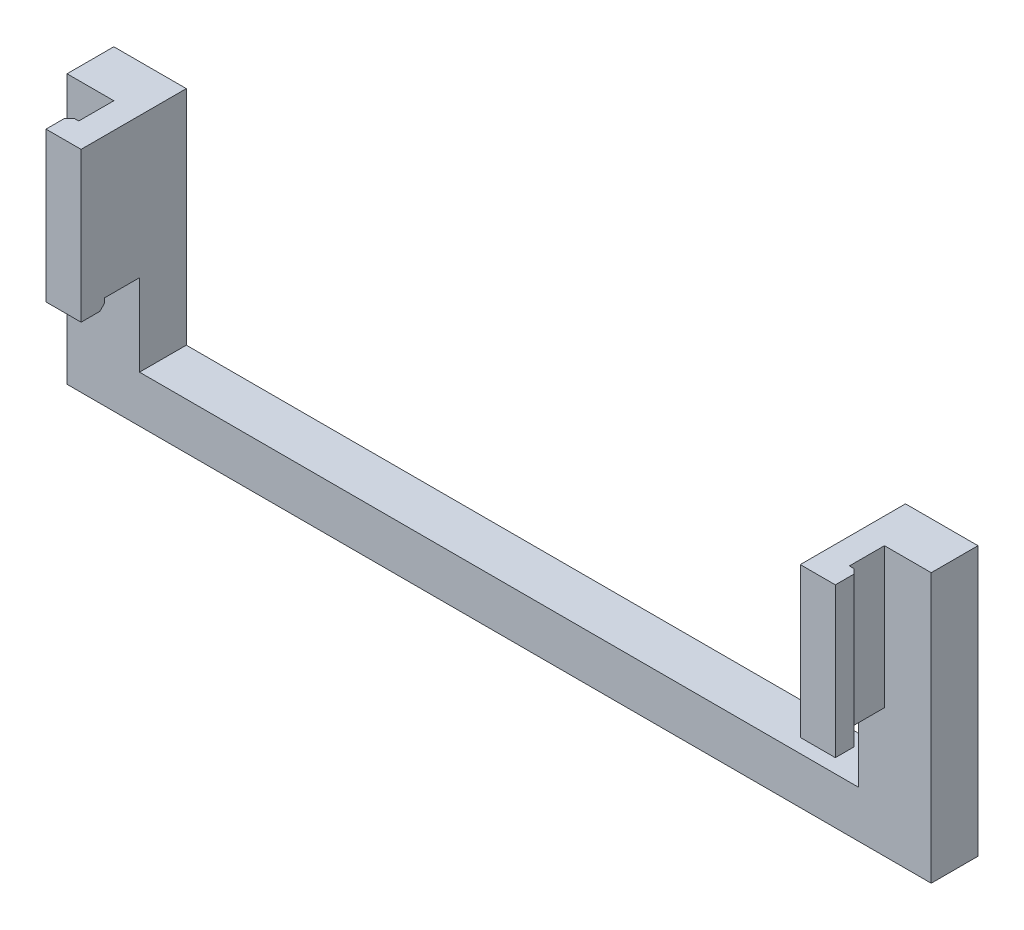
ISO-10303-21;
HEADER;
FILE_DESCRIPTION(('STEP AP214'),'2;1');
FILE_NAME('part.step','',(''),(''),'','','');
FILE_SCHEMA(('AUTOMOTIVE_DESIGN { 1 0 10303 214 1 1 1 1 }'));
ENDSEC;
DATA;
#1=APPLICATION_CONTEXT('core data for automotive mechanical design processes');
#2=APPLICATION_PROTOCOL_DEFINITION('international standard','automotive_design',2000,#1);
#3=PRODUCT_CONTEXT('',#1,'mechanical');
#4=PRODUCT('Part','Part','',(#3));
#5=PRODUCT_RELATED_PRODUCT_CATEGORY('part','',(#4));
#6=PRODUCT_DEFINITION_FORMATION('','',#4);
#7=PRODUCT_DEFINITION_CONTEXT('part definition',#1,'design');
#8=PRODUCT_DEFINITION('design','',#6,#7);
#9=PRODUCT_DEFINITION_SHAPE('','',#8);
#10=(LENGTH_UNIT() NAMED_UNIT(*) SI_UNIT(.MILLI.,.METRE.));
#11=(NAMED_UNIT(*) PLANE_ANGLE_UNIT() SI_UNIT($,.RADIAN.));
#12=(NAMED_UNIT(*) SI_UNIT($,.STERADIAN.) SOLID_ANGLE_UNIT());
#13=UNCERTAINTY_MEASURE_WITH_UNIT(LENGTH_MEASURE(1.E-05),#10,'distance_accuracy_value','');
#14=(GEOMETRIC_REPRESENTATION_CONTEXT(3) GLOBAL_UNCERTAINTY_ASSIGNED_CONTEXT((#13)) GLOBAL_UNIT_ASSIGNED_CONTEXT((#10,
#11,#12)) REPRESENTATION_CONTEXT('',''));
#15=CARTESIAN_POINT('',(0.,0.,0.));
#16=DIRECTION('',(0.,0.,1.));
#17=DIRECTION('',(1.,0.,0.));
#18=AXIS2_PLACEMENT_3D('',#15,#16,#17);
#19=CARTESIAN_POINT('',(0.,0.,0.));
#20=DIRECTION('',(0.,0.,-1.));
#21=DIRECTION('',(-1.,0.,0.));
#22=AXIS2_PLACEMENT_3D('',#19,#20,#21);
#23=PLANE('',#22);
#24=DIRECTION('',(1.,0.,0.));
#25=VECTOR('',#24,1.);
#26=CARTESIAN_POINT('',(296.806912390065,75.4547324301416,0.));
#27=LINE('',#26,#25);
#28=CARTESIAN_POINT('',(296.806912390065,75.4547324301416,0.));
#29=VERTEX_POINT('',#28);
#30=CARTESIAN_POINT('',(297.906988381274,75.4547324301416,0.));
#31=VERTEX_POINT('',#30);
#32=EDGE_CURVE('E260',#29,#31,#27,.T.);
#33=ORIENTED_EDGE('',*,*,#32,.F.);
#34=DIRECTION('',(0.,1.,0.));
#35=VECTOR('',#34,1.);
#36=CARTESIAN_POINT('',(296.806912390065,81.4554276026631,0.));
#37=LINE('',#36,#35);
#38=CARTESIAN_POINT('',(296.806912390065,71.9547324301416,0.));
#39=VERTEX_POINT('',#38);
#40=EDGE_CURVE('E306',#39,#29,#37,.T.);
#41=ORIENTED_EDGE('',*,*,#40,.F.);
#42=DIRECTION('',(1.,0.,0.));
#43=VECTOR('',#42,1.);
#44=CARTESIAN_POINT('',(296.806912390065,71.9547324301416,0.));
#45=LINE('',#44,#43);
#46=CARTESIAN_POINT('',(266.055906266466,71.9547324301416,0.));
#47=VERTEX_POINT('',#46);
#48=EDGE_CURVE('E310',#47,#39,#45,.T.);
#49=ORIENTED_EDGE('',*,*,#48,.F.);
#50=DIRECTION('',(0.,-1.,0.));
#51=VECTOR('',#50,1.);
#52=CARTESIAN_POINT('',(266.055906266466,81.4554276026631,0.));
#53=LINE('',#52,#51);
#54=CARTESIAN_POINT('',(266.055906266466,75.4547324301416,0.));
#55=VERTEX_POINT('',#54);
#56=EDGE_CURVE('E314',#55,#47,#53,.T.);
#57=ORIENTED_EDGE('',*,*,#56,.F.);
#58=DIRECTION('',(1.,0.,0.));
#59=VECTOR('',#58,1.);
#60=CARTESIAN_POINT('',(266.055906266466,75.4547324301416,0.));
#61=LINE('',#60,#59);
#62=CARTESIAN_POINT('',(264.955830275258,75.4547324301416,0.));
#63=VERTEX_POINT('',#62);
#64=EDGE_CURVE('E274',#63,#55,#61,.T.);
#65=ORIENTED_EDGE('',*,*,#64,.F.);
#66=DIRECTION('',(0.,-1.,0.));
#67=VECTOR('',#66,1.);
#68=CARTESIAN_POINT('',(264.955830275258,81.4554276026631,0.));
#69=LINE('',#68,#67);
#70=CARTESIAN_POINT('',(264.955830275258,81.4554276026631,0.));
#71=VERTEX_POINT('',#70);
#72=EDGE_CURVE('E279',#71,#63,#69,.T.);
#73=ORIENTED_EDGE('',*,*,#72,.F.);
#74=DIRECTION('',(1.,0.,0.));
#75=VECTOR('',#74,1.);
#76=CARTESIAN_POINT('',(262.955830275258,81.4554276026631,0.));
#77=LINE('',#76,#75);
#78=CARTESIAN_POINT('',(262.955830275258,81.4554276026631,0.));
#79=VERTEX_POINT('',#78);
#80=EDGE_CURVE('E317',#79,#71,#77,.T.);
#81=ORIENTED_EDGE('',*,*,#80,.F.);
#82=DIRECTION('',(0.,1.,0.));
#83=VECTOR('',#82,1.);
#84=CARTESIAN_POINT('',(262.955830275258,69.9547324301416,0.));
#85=LINE('',#84,#83);
#86=CARTESIAN_POINT('',(262.955830275258,69.9547324301416,0.));
#87=VERTEX_POINT('',#86);
#88=EDGE_CURVE('E321',#87,#79,#85,.T.);
#89=ORIENTED_EDGE('',*,*,#88,.F.);
#90=DIRECTION('',(-1.,0.,0.));
#91=VECTOR('',#90,1.);
#92=CARTESIAN_POINT('',(299.906988381274,69.9547324301416,0.));
#93=LINE('',#92,#91);
#94=CARTESIAN_POINT('',(299.906988381274,69.9547324301416,0.));
#95=VERTEX_POINT('',#94);
#96=EDGE_CURVE('E295',#95,#87,#93,.T.);
#97=ORIENTED_EDGE('',*,*,#96,.F.);
#98=DIRECTION('',(0.,-1.,0.));
#99=VECTOR('',#98,1.);
#100=CARTESIAN_POINT('',(299.906988381274,69.9547324301416,0.));
#101=LINE('',#100,#99);
#102=CARTESIAN_POINT('',(299.906988381274,81.4554276026631,0.));
#103=VERTEX_POINT('',#102);
#104=EDGE_CURVE('E300',#103,#95,#101,.T.);
#105=ORIENTED_EDGE('',*,*,#104,.F.);
#106=DIRECTION('',(1.,0.,0.));
#107=VECTOR('',#106,1.);
#108=CARTESIAN_POINT('',(296.806912390065,81.4554276026631,0.));
#109=LINE('',#108,#107);
#110=CARTESIAN_POINT('',(297.906988381274,81.4554276026631,0.));
#111=VERTEX_POINT('',#110);
#112=EDGE_CURVE('E304',#111,#103,#109,.T.);
#113=ORIENTED_EDGE('',*,*,#112,.F.);
#114=DIRECTION('',(0.,1.,0.));
#115=VECTOR('',#114,1.);
#116=CARTESIAN_POINT('',(297.906988381274,81.4554276026631,0.));
#117=LINE('',#116,#115);
#118=EDGE_CURVE('E256',#31,#111,#117,.T.);
#119=ORIENTED_EDGE('',*,*,#118,.F.);
#120=EDGE_LOOP('',(#33,#41,#49,#57,#65,#73,#81,#89,#97,#105,#113,#119));
#121=FACE_BOUND('',#120,.T.);
#122=ADVANCED_FACE('F35',(#121),#23,.F.);
#123=CARTESIAN_POINT('',(262.955830275258,69.9547324301416,-40.699535847695));
#124=DIRECTION('',(1.,0.,0.));
#125=DIRECTION('',(0.,0.,-1.));
#126=AXIS2_PLACEMENT_3D('',#123,#124,#125);
#127=PLANE('',#126);
#128=DIRECTION('',(0.,1.,0.));
#129=VECTOR('',#128,1.);
#130=CARTESIAN_POINT('',(262.955830275258,69.9547324301416,-2.));
#131=LINE('',#130,#129);
#132=CARTESIAN_POINT('',(262.955830275258,69.9547324301416,-2.));
#133=VERTEX_POINT('',#132);
#134=CARTESIAN_POINT('',(262.955830275258,81.4554276026631,-2.));
#135=VERTEX_POINT('',#134);
#136=EDGE_CURVE('E342',#133,#135,#131,.T.);
#137=ORIENTED_EDGE('',*,*,#136,.F.);
#138=DIRECTION('',(0.,0.,1.));
#139=VECTOR('',#138,1.);
#140=CARTESIAN_POINT('',(262.955830275258,69.9547324301416,-40.699535847695));
#141=LINE('',#140,#139);
#142=EDGE_CURVE('E286',#133,#87,#141,.T.);
#143=ORIENTED_EDGE('',*,*,#142,.T.);
#144=ORIENTED_EDGE('',*,*,#88,.T.);
#145=DIRECTION('',(0.,0.,1.));
#146=VECTOR('',#145,1.);
#147=CARTESIAN_POINT('',(262.955830275258,81.4554276026631,-40.699535847695));
#148=LINE('',#147,#146);
#149=EDGE_CURVE('E320',#135,#79,#148,.T.);
#150=ORIENTED_EDGE('',*,*,#149,.F.);
#151=EDGE_LOOP('',(#137,#143,#144,#150));
#152=FACE_BOUND('',#151,.T.);
#153=ADVANCED_FACE('F419',(#152),#127,.F.);
#154=CARTESIAN_POINT('',(262.955830275258,81.4554276026631,-40.699535847695));
#155=DIRECTION('',(0.,-1.,0.));
#156=DIRECTION('',(0.,0.,-1.));
#157=AXIS2_PLACEMENT_3D('',#154,#155,#156);
#158=PLANE('',#157);
#159=DIRECTION('',(-1.,0.,0.));
#160=VECTOR('',#159,1.);
#161=CARTESIAN_POINT('',(266.055906266466,81.4554276026631,1.5));
#162=LINE('',#161,#160);
#163=CARTESIAN_POINT('',(264.955830275258,81.4554276026631,1.5));
#164=VERTEX_POINT('',#163);
#165=CARTESIAN_POINT('',(264.755830275258,81.4554276026631,1.5));
#166=VERTEX_POINT('',#165);
#167=EDGE_CURVE('E235',#164,#166,#162,.T.);
#168=ORIENTED_EDGE('',*,*,#167,.T.);
#169=DIRECTION('',(-0.707106781186518,0.,0.707106781186577));
#170=VECTOR('',#169,1.);
#171=CARTESIAN_POINT('',(264.555830275258,81.4554276026631,1.69999999999999));
#172=LINE('',#171,#170);
#173=CARTESIAN_POINT('',(264.555830275258,81.4554276026631,1.69999999999999));
#174=VERTEX_POINT('',#173);
#175=EDGE_CURVE('E11',#166,#174,#172,.T.);
#176=ORIENTED_EDGE('',*,*,#175,.T.);
#177=DIRECTION('',(0.,0.,-1.));
#178=VECTOR('',#177,1.);
#179=CARTESIAN_POINT('',(264.555830275258,81.4554276026631,9.07412554420277));
#180=LINE('',#179,#178);
#181=CARTESIAN_POINT('',(264.555830275258,81.4554276026631,2.5));
#182=VERTEX_POINT('',#181);
#183=EDGE_CURVE('E237',#182,#174,#180,.T.);
#184=ORIENTED_EDGE('',*,*,#183,.F.);
#185=DIRECTION('',(-1.,0.,0.));
#186=VECTOR('',#185,1.);
#187=CARTESIAN_POINT('',(266.055906266466,81.4554276026631,2.5));
#188=LINE('',#187,#186);
#189=CARTESIAN_POINT('',(266.055906266466,81.4554276026631,2.5));
#190=VERTEX_POINT('',#189);
#191=EDGE_CURVE('E243',#190,#182,#188,.T.);
#192=ORIENTED_EDGE('',*,*,#191,.F.);
#193=DIRECTION('',(0.,0.,1.));
#194=VECTOR('',#193,1.);
#195=CARTESIAN_POINT('',(266.055906266466,81.4554276026631,-40.699535847695));
#196=LINE('',#195,#194);
#197=CARTESIAN_POINT('',(266.055906266466,81.4554276026631,-2.));
#198=VERTEX_POINT('',#197);
#199=EDGE_CURVE('E316',#198,#190,#196,.T.);
#200=ORIENTED_EDGE('',*,*,#199,.F.);
#201=DIRECTION('',(1.,0.,0.));
#202=VECTOR('',#201,1.);
#203=CARTESIAN_POINT('',(262.955830275258,81.4554276026631,-2.));
#204=LINE('',#203,#202);
#205=EDGE_CURVE('E339',#135,#198,#204,.T.);
#206=ORIENTED_EDGE('',*,*,#205,.F.);
#207=ORIENTED_EDGE('',*,*,#149,.T.);
#208=ORIENTED_EDGE('',*,*,#80,.T.);
#209=DIRECTION('',(0.,0.,-1.));
#210=VECTOR('',#209,1.);
#211=CARTESIAN_POINT('',(264.955830275258,81.4554276026631,7.60069747979323));
#212=LINE('',#211,#210);
#213=EDGE_CURVE('E282',#164,#71,#212,.T.);
#214=ORIENTED_EDGE('',*,*,#213,.F.);
#215=EDGE_LOOP('',(#168,#176,#184,#192,#200,#206,#207,#208,#214));
#216=FACE_BOUND('',#215,.T.);
#217=ADVANCED_FACE('F392',(#216),#158,.F.);
#218=CARTESIAN_POINT('',(266.055906266466,81.4554276026631,-40.699535847695));
#219=DIRECTION('',(-1.,0.,0.));
#220=DIRECTION('',(0.,0.,1.));
#221=AXIS2_PLACEMENT_3D('',#218,#219,#220);
#222=PLANE('',#221);
#223=DIRECTION('',(0.,0.,-1.));
#224=VECTOR('',#223,1.);
#225=CARTESIAN_POINT('',(266.055906266466,75.0547324301416,9.07412554420277));
#226=LINE('',#225,#224);
#227=CARTESIAN_POINT('',(266.055906266466,75.0547324301416,2.5));
#228=VERTEX_POINT('',#227);
#229=CARTESIAN_POINT('',(266.055906266466,75.0547324301416,1.69999999999999));
#230=VERTEX_POINT('',#229);
#231=EDGE_CURVE('E220',#228,#230,#226,.T.);
#232=ORIENTED_EDGE('',*,*,#231,.T.);
#233=DIRECTION('',(0.,0.707106781186518,-0.707106781186577));
#234=VECTOR('',#233,1.);
#235=CARTESIAN_POINT('',(266.055906266466,75.0547324301416,1.69999999999999));
#236=LINE('',#235,#234);
#237=CARTESIAN_POINT('',(266.055906266466,75.2547324301416,1.5));
#238=VERTEX_POINT('',#237);
#239=EDGE_CURVE('E371',#230,#238,#236,.T.);
#240=ORIENTED_EDGE('',*,*,#239,.T.);
#241=DIRECTION('',(0.,1.,0.));
#242=VECTOR('',#241,1.);
#243=CARTESIAN_POINT('',(266.055906266466,81.4554276026631,1.5));
#244=LINE('',#243,#242);
#245=CARTESIAN_POINT('',(266.055906266466,75.4547324301416,1.5));
#246=VERTEX_POINT('',#245);
#247=EDGE_CURVE('E223',#238,#246,#244,.T.);
#248=ORIENTED_EDGE('',*,*,#247,.T.);
#249=DIRECTION('',(0.,0.,-1.));
#250=VECTOR('',#249,1.);
#251=CARTESIAN_POINT('',(266.055906266466,75.4547324301416,7.60069747979323));
#252=LINE('',#251,#250);
#253=EDGE_CURVE('E266',#246,#55,#252,.T.);
#254=ORIENTED_EDGE('',*,*,#253,.T.);
#255=ORIENTED_EDGE('',*,*,#56,.T.);
#256=DIRECTION('',(0.,0.,1.));
#257=VECTOR('',#256,1.);
#258=CARTESIAN_POINT('',(266.055906266466,71.9547324301416,-40.699535847695));
#259=LINE('',#258,#257);
#260=CARTESIAN_POINT('',(266.055906266466,71.9547324301416,-2.));
#261=VERTEX_POINT('',#260);
#262=EDGE_CURVE('E313',#261,#47,#259,.T.);
#263=ORIENTED_EDGE('',*,*,#262,.F.);
#264=DIRECTION('',(0.,-1.,0.));
#265=VECTOR('',#264,1.);
#266=CARTESIAN_POINT('',(266.055906266466,81.4554276026631,-2.));
#267=LINE('',#266,#265);
#268=EDGE_CURVE('E336',#198,#261,#267,.T.);
#269=ORIENTED_EDGE('',*,*,#268,.F.);
#270=ORIENTED_EDGE('',*,*,#199,.T.);
#271=DIRECTION('',(0.,1.,0.));
#272=VECTOR('',#271,1.);
#273=CARTESIAN_POINT('',(266.055906266466,81.4554276026631,2.5));
#274=LINE('',#273,#272);
#275=EDGE_CURVE('E246',#228,#190,#274,.T.);
#276=ORIENTED_EDGE('',*,*,#275,.F.);
#277=EDGE_LOOP('',(#232,#240,#248,#254,#255,#263,#269,#270,#276));
#278=FACE_BOUND('',#277,.T.);
#279=ADVANCED_FACE('F401',(#278),#222,.F.);
#280=CARTESIAN_POINT('',(296.806912390065,71.9547324301416,-40.699535847695));
#281=DIRECTION('',(0.,-1.,0.));
#282=DIRECTION('',(0.,0.,-1.));
#283=AXIS2_PLACEMENT_3D('',#280,#281,#282);
#284=PLANE('',#283);
#285=DIRECTION('',(1.,0.,0.));
#286=VECTOR('',#285,1.);
#287=CARTESIAN_POINT('',(296.806912390065,71.9547324301416,-2.));
#288=LINE('',#287,#286);
#289=CARTESIAN_POINT('',(296.806912390065,71.9547324301416,-2.));
#290=VERTEX_POINT('',#289);
#291=EDGE_CURVE('E333',#261,#290,#288,.T.);
#292=ORIENTED_EDGE('',*,*,#291,.F.);
#293=ORIENTED_EDGE('',*,*,#262,.T.);
#294=ORIENTED_EDGE('',*,*,#48,.T.);
#295=DIRECTION('',(0.,0.,1.));
#296=VECTOR('',#295,1.);
#297=CARTESIAN_POINT('',(296.806912390065,71.9547324301416,-40.699535847695));
#298=LINE('',#297,#296);
#299=EDGE_CURVE('E309',#290,#39,#298,.T.);
#300=ORIENTED_EDGE('',*,*,#299,.F.);
#301=EDGE_LOOP('',(#292,#293,#294,#300));
#302=FACE_BOUND('',#301,.T.);
#303=ADVANCED_FACE('F428',(#302),#284,.F.);
#304=CARTESIAN_POINT('',(296.806912390065,81.4554276026631,-40.699535847695));
#305=DIRECTION('',(1.,0.,0.));
#306=DIRECTION('',(0.,0.,-1.));
#307=AXIS2_PLACEMENT_3D('',#304,#305,#306);
#308=PLANE('',#307);
#309=DIRECTION('',(0.,-1.,0.));
#310=VECTOR('',#309,1.);
#311=CARTESIAN_POINT('',(296.806912390065,81.4554276026631,1.5));
#312=LINE('',#311,#310);
#313=CARTESIAN_POINT('',(296.806912390065,75.4547324301416,1.5));
#314=VERTEX_POINT('',#313);
#315=CARTESIAN_POINT('',(296.806912390065,75.2547324301417,1.5));
#316=VERTEX_POINT('',#315);
#317=EDGE_CURVE('E227',#314,#316,#312,.T.);
#318=ORIENTED_EDGE('',*,*,#317,.T.);
#319=DIRECTION('',(0.,0.707106781186542,-0.707106781186553));
#320=VECTOR('',#319,1.);
#321=CARTESIAN_POINT('',(296.806912390065,75.0547324301417,1.70000000000001));
#322=LINE('',#321,#320);
#323=CARTESIAN_POINT('',(296.806912390065,75.0547324301417,1.70000000000001));
#324=VERTEX_POINT('',#323);
#325=EDGE_CURVE('E366',#316,#324,#322,.F.);
#326=ORIENTED_EDGE('',*,*,#325,.T.);
#327=DIRECTION('',(0.,0.,-1.));
#328=VECTOR('',#327,1.);
#329=CARTESIAN_POINT('',(296.806912390065,75.0547324301417,9.07412554420277));
#330=LINE('',#329,#328);
#331=CARTESIAN_POINT('',(296.806912390065,75.0547324301417,2.5));
#332=VERTEX_POINT('',#331);
#333=EDGE_CURVE('E231',#332,#324,#330,.T.);
#334=ORIENTED_EDGE('',*,*,#333,.F.);
#335=DIRECTION('',(0.,-1.,0.));
#336=VECTOR('',#335,1.);
#337=CARTESIAN_POINT('',(296.806912390065,81.4554276026631,2.5));
#338=LINE('',#337,#336);
#339=CARTESIAN_POINT('',(296.806912390065,81.4554276026631,2.5));
#340=VERTEX_POINT('',#339);
#341=EDGE_CURVE('E215',#340,#332,#338,.T.);
#342=ORIENTED_EDGE('',*,*,#341,.F.);
#343=DIRECTION('',(0.,0.,1.));
#344=VECTOR('',#343,1.);
#345=CARTESIAN_POINT('',(296.806912390065,81.4554276026631,-40.699535847695));
#346=LINE('',#345,#344);
#347=CARTESIAN_POINT('',(296.806912390065,81.4554276026631,-2.));
#348=VERTEX_POINT('',#347);
#349=EDGE_CURVE('E211',#348,#340,#346,.T.);
#350=ORIENTED_EDGE('',*,*,#349,.F.);
#351=DIRECTION('',(0.,1.,0.));
#352=VECTOR('',#351,1.);
#353=CARTESIAN_POINT('',(296.806912390065,81.4554276026631,-2.));
#354=LINE('',#353,#352);
#355=EDGE_CURVE('E330',#290,#348,#354,.T.);
#356=ORIENTED_EDGE('',*,*,#355,.F.);
#357=ORIENTED_EDGE('',*,*,#299,.T.);
#358=ORIENTED_EDGE('',*,*,#40,.T.);
#359=DIRECTION('',(0.,0.,-1.));
#360=VECTOR('',#359,1.);
#361=CARTESIAN_POINT('',(296.806912390065,75.4547324301416,7.60069747979323));
#362=LINE('',#361,#360);
#363=EDGE_CURVE('E242',#314,#29,#362,.T.);
#364=ORIENTED_EDGE('',*,*,#363,.F.);
#365=EDGE_LOOP('',(#318,#326,#334,#342,#350,#356,#357,#358,#364));
#366=FACE_BOUND('',#365,.T.);
#367=ADVANCED_FACE('F430',(#366),#308,.F.);
#368=CARTESIAN_POINT('',(296.806912390065,81.4554276026631,-40.699535847695));
#369=DIRECTION('',(0.,-1.,0.));
#370=DIRECTION('',(0.,0.,-1.));
#371=AXIS2_PLACEMENT_3D('',#368,#369,#370);
#372=PLANE('',#371);
#373=DIRECTION('',(0.,0.,-1.));
#374=VECTOR('',#373,1.);
#375=CARTESIAN_POINT('',(298.306988381274,81.4554276026631,9.07412554420277));
#376=LINE('',#375,#374);
#377=CARTESIAN_POINT('',(298.306988381274,81.4554276026631,2.5));
#378=VERTEX_POINT('',#377);
#379=CARTESIAN_POINT('',(298.306988381274,81.4554276026631,1.70000000000001));
#380=VERTEX_POINT('',#379);
#381=EDGE_CURVE('E194',#378,#380,#376,.T.);
#382=ORIENTED_EDGE('',*,*,#381,.T.);
#383=DIRECTION('',(0.707106781186493,0.,0.707106781186602));
#384=VECTOR('',#383,1.);
#385=CARTESIAN_POINT('',(298.306988381274,81.4554276026631,1.70000000000001));
#386=LINE('',#385,#384);
#387=CARTESIAN_POINT('',(298.106988381274,81.4554276026631,1.5));
#388=VERTEX_POINT('',#387);
#389=EDGE_CURVE('E358',#380,#388,#386,.F.);
#390=ORIENTED_EDGE('',*,*,#389,.T.);
#391=DIRECTION('',(-1.,0.,0.));
#392=VECTOR('',#391,1.);
#393=CARTESIAN_POINT('',(296.806912390065,81.4554276026631,1.5));
#394=LINE('',#393,#392);
#395=CARTESIAN_POINT('',(297.906988381274,81.4554276026631,1.5));
#396=VERTEX_POINT('',#395);
#397=EDGE_CURVE('E204',#388,#396,#394,.T.);
#398=ORIENTED_EDGE('',*,*,#397,.T.);
#399=DIRECTION('',(0.,0.,-1.));
#400=VECTOR('',#399,1.);
#401=CARTESIAN_POINT('',(297.906988381274,81.4554276026631,7.60069747979323));
#402=LINE('',#401,#400);
#403=EDGE_CURVE('E258',#396,#111,#402,.T.);
#404=ORIENTED_EDGE('',*,*,#403,.T.);
#405=ORIENTED_EDGE('',*,*,#112,.T.);
#406=DIRECTION('',(0.,0.,1.));
#407=VECTOR('',#406,1.);
#408=CARTESIAN_POINT('',(299.906988381274,81.4554276026631,-40.699535847695));
#409=LINE('',#408,#407);
#410=CARTESIAN_POINT('',(299.906988381274,81.4554276026631,-2.));
#411=VERTEX_POINT('',#410);
#412=EDGE_CURVE('E303',#411,#103,#409,.T.);
#413=ORIENTED_EDGE('',*,*,#412,.F.);
#414=DIRECTION('',(1.,0.,0.));
#415=VECTOR('',#414,1.);
#416=CARTESIAN_POINT('',(296.806912390065,81.4554276026631,-2.));
#417=LINE('',#416,#415);
#418=EDGE_CURVE('E327',#348,#411,#417,.T.);
#419=ORIENTED_EDGE('',*,*,#418,.F.);
#420=ORIENTED_EDGE('',*,*,#349,.T.);
#421=DIRECTION('',(-1.,0.,0.));
#422=VECTOR('',#421,1.);
#423=CARTESIAN_POINT('',(296.806912390065,81.4554276026631,2.5));
#424=LINE('',#423,#422);
#425=EDGE_CURVE('E208',#378,#340,#424,.T.);
#426=ORIENTED_EDGE('',*,*,#425,.F.);
#427=EDGE_LOOP('',(#382,#390,#398,#404,#405,#413,#419,#420,#426));
#428=FACE_BOUND('',#427,.T.);
#429=ADVANCED_FACE('F209',(#428),#372,.F.);
#430=CARTESIAN_POINT('',(299.906988381274,69.9547324301416,-40.699535847695));
#431=DIRECTION('',(-1.,0.,0.));
#432=DIRECTION('',(0.,0.,1.));
#433=AXIS2_PLACEMENT_3D('',#430,#431,#432);
#434=PLANE('',#433);
#435=DIRECTION('',(0.,-1.,0.));
#436=VECTOR('',#435,1.);
#437=CARTESIAN_POINT('',(299.906988381274,69.9547324301416,-2.));
#438=LINE('',#437,#436);
#439=CARTESIAN_POINT('',(299.906988381274,69.9547324301416,-2.));
#440=VERTEX_POINT('',#439);
#441=EDGE_CURVE('E324',#411,#440,#438,.T.);
#442=ORIENTED_EDGE('',*,*,#441,.F.);
#443=ORIENTED_EDGE('',*,*,#412,.T.);
#444=ORIENTED_EDGE('',*,*,#104,.T.);
#445=DIRECTION('',(0.,0.,1.));
#446=VECTOR('',#445,1.);
#447=CARTESIAN_POINT('',(299.906988381274,69.9547324301416,-40.699535847695));
#448=LINE('',#447,#446);
#449=EDGE_CURVE('E299',#440,#95,#448,.T.);
#450=ORIENTED_EDGE('',*,*,#449,.F.);
#451=EDGE_LOOP('',(#442,#443,#444,#450));
#452=FACE_BOUND('',#451,.T.);
#453=ADVANCED_FACE('F456',(#452),#434,.F.);
#454=CARTESIAN_POINT('',(299.906988381274,69.9547324301416,-40.699535847695));
#455=DIRECTION('',(0.,1.,0.));
#456=DIRECTION('',(0.,0.,1.));
#457=AXIS2_PLACEMENT_3D('',#454,#455,#456);
#458=PLANE('',#457);
#459=DIRECTION('',(-1.,0.,0.));
#460=VECTOR('',#459,1.);
#461=CARTESIAN_POINT('',(299.906988381274,69.9547324301416,-2.));
#462=LINE('',#461,#460);
#463=EDGE_CURVE('E298',#440,#133,#462,.T.);
#464=ORIENTED_EDGE('',*,*,#463,.F.);
#465=ORIENTED_EDGE('',*,*,#449,.T.);
#466=ORIENTED_EDGE('',*,*,#96,.T.);
#467=ORIENTED_EDGE('',*,*,#142,.F.);
#468=EDGE_LOOP('',(#464,#465,#466,#467));
#469=FACE_BOUND('',#468,.T.);
#470=ADVANCED_FACE('F458',(#469),#458,.F.);
#471=CARTESIAN_POINT('',(0.,0.,-2.));
#472=DIRECTION('',(0.,0.,-1.));
#473=DIRECTION('',(-1.,0.,0.));
#474=AXIS2_PLACEMENT_3D('',#471,#472,#473);
#475=PLANE('',#474);
#476=ORIENTED_EDGE('',*,*,#463,.T.);
#477=ORIENTED_EDGE('',*,*,#136,.T.);
#478=ORIENTED_EDGE('',*,*,#205,.T.);
#479=ORIENTED_EDGE('',*,*,#268,.T.);
#480=ORIENTED_EDGE('',*,*,#291,.T.);
#481=ORIENTED_EDGE('',*,*,#355,.T.);
#482=ORIENTED_EDGE('',*,*,#418,.T.);
#483=ORIENTED_EDGE('',*,*,#441,.T.);
#484=EDGE_LOOP('',(#476,#477,#478,#479,#480,#481,#482,#483));
#485=FACE_BOUND('',#484,.T.);
#486=ADVANCED_FACE('F415',(#485),#475,.T.);
#487=CARTESIAN_POINT('',(264.955830275258,81.4554276026631,7.60069747979323));
#488=DIRECTION('',(1.,0.,0.));
#489=DIRECTION('',(0.,0.,-1.));
#490=AXIS2_PLACEMENT_3D('',#487,#488,#489);
#491=PLANE('',#490);
#492=DIRECTION('',(0.,-1.,0.));
#493=VECTOR('',#492,1.);
#494=CARTESIAN_POINT('',(264.955830275258,81.4554276026631,1.5));
#495=LINE('',#494,#493);
#496=CARTESIAN_POINT('',(264.955830275258,75.4547324301416,1.5));
#497=VERTEX_POINT('',#496);
#498=EDGE_CURVE('E283',#164,#497,#495,.T.);
#499=ORIENTED_EDGE('',*,*,#498,.F.);
#500=ORIENTED_EDGE('',*,*,#213,.T.);
#501=ORIENTED_EDGE('',*,*,#72,.T.);
#502=DIRECTION('',(0.,0.,-1.));
#503=VECTOR('',#502,1.);
#504=CARTESIAN_POINT('',(264.955830275258,75.4547324301416,7.60069747979323));
#505=LINE('',#504,#503);
#506=EDGE_CURVE('E278',#497,#63,#505,.T.);
#507=ORIENTED_EDGE('',*,*,#506,.F.);
#508=EDGE_LOOP('',(#499,#500,#501,#507));
#509=FACE_BOUND('',#508,.T.);
#510=ADVANCED_FACE('F395',(#509),#491,.F.);
#511=CARTESIAN_POINT('',(266.055906266466,75.4547324301416,7.60069747979323));
#512=DIRECTION('',(0.,1.,0.));
#513=DIRECTION('',(0.,0.,1.));
#514=AXIS2_PLACEMENT_3D('',#511,#512,#513);
#515=PLANE('',#514);
#516=DIRECTION('',(1.,0.,0.));
#517=VECTOR('',#516,1.);
#518=CARTESIAN_POINT('',(266.055906266466,75.4547324301416,1.5));
#519=LINE('',#518,#517);
#520=EDGE_CURVE('E277',#497,#246,#519,.T.);
#521=ORIENTED_EDGE('',*,*,#520,.F.);
#522=ORIENTED_EDGE('',*,*,#506,.T.);
#523=ORIENTED_EDGE('',*,*,#64,.T.);
#524=ORIENTED_EDGE('',*,*,#253,.F.);
#525=EDGE_LOOP('',(#521,#522,#523,#524));
#526=FACE_BOUND('',#525,.T.);
#527=ADVANCED_FACE('F399',(#526),#515,.F.);
#528=CARTESIAN_POINT('',(296.806912390065,75.4547324301416,7.60069747979323));
#529=DIRECTION('',(0.,1.,0.));
#530=DIRECTION('',(0.,0.,1.));
#531=AXIS2_PLACEMENT_3D('',#528,#529,#530);
#532=PLANE('',#531);
#533=DIRECTION('',(1.,0.,0.));
#534=VECTOR('',#533,1.);
#535=CARTESIAN_POINT('',(296.806912390065,75.4547324301416,1.5));
#536=LINE('',#535,#534);
#537=CARTESIAN_POINT('',(297.906988381274,75.4547324301416,1.5));
#538=VERTEX_POINT('',#537);
#539=EDGE_CURVE('E267',#314,#538,#536,.T.);
#540=ORIENTED_EDGE('',*,*,#539,.F.);
#541=ORIENTED_EDGE('',*,*,#363,.T.);
#542=ORIENTED_EDGE('',*,*,#32,.T.);
#543=DIRECTION('',(0.,0.,-1.));
#544=VECTOR('',#543,1.);
#545=CARTESIAN_POINT('',(297.906988381274,75.4547324301416,7.60069747979323));
#546=LINE('',#545,#544);
#547=EDGE_CURVE('E259',#538,#31,#546,.T.);
#548=ORIENTED_EDGE('',*,*,#547,.F.);
#549=EDGE_LOOP('',(#540,#541,#542,#548));
#550=FACE_BOUND('',#549,.T.);
#551=ADVANCED_FACE('F449',(#550),#532,.F.);
#552=CARTESIAN_POINT('',(297.906988381274,81.4554276026631,7.60069747979323));
#553=DIRECTION('',(-1.,0.,0.));
#554=DIRECTION('',(0.,0.,1.));
#555=AXIS2_PLACEMENT_3D('',#552,#553,#554);
#556=PLANE('',#555);
#557=DIRECTION('',(0.,1.,0.));
#558=VECTOR('',#557,1.);
#559=CARTESIAN_POINT('',(297.906988381274,81.4554276026631,1.5));
#560=LINE('',#559,#558);
#561=EDGE_CURVE('E263',#538,#396,#560,.T.);
#562=ORIENTED_EDGE('',*,*,#561,.F.);
#563=ORIENTED_EDGE('',*,*,#547,.T.);
#564=ORIENTED_EDGE('',*,*,#118,.T.);
#565=ORIENTED_EDGE('',*,*,#403,.F.);
#566=EDGE_LOOP('',(#562,#563,#564,#565));
#567=FACE_BOUND('',#566,.T.);
#568=ADVANCED_FACE('F447',(#567),#556,.F.);
#569=CARTESIAN_POINT('',(264.555830275258,81.4554276026631,9.07412554420277));
#570=DIRECTION('',(1.,0.,0.));
#571=DIRECTION('',(0.,0.,-1.));
#572=AXIS2_PLACEMENT_3D('',#569,#570,#571);
#573=PLANE('',#572);
#574=ORIENTED_EDGE('',*,*,#183,.T.);
#575=DIRECTION('',(0.,-1.,0.));
#576=VECTOR('',#575,1.);
#577=CARTESIAN_POINT('',(264.555830275258,75.0547324301416,1.69999999999999));
#578=LINE('',#577,#576);
#579=CARTESIAN_POINT('',(264.555830275258,75.0547324301416,1.69999999999999));
#580=VERTEX_POINT('',#579);
#581=EDGE_CURVE('E45',#174,#580,#578,.T.);
#582=ORIENTED_EDGE('',*,*,#581,.T.);
#583=DIRECTION('',(0.,0.,-1.));
#584=VECTOR('',#583,1.);
#585=CARTESIAN_POINT('',(264.555830275258,75.0547324301416,9.07412554420277));
#586=LINE('',#585,#584);
#587=CARTESIAN_POINT('',(264.555830275258,75.0547324301416,2.5));
#588=VERTEX_POINT('',#587);
#589=EDGE_CURVE('E252',#588,#580,#586,.T.);
#590=ORIENTED_EDGE('',*,*,#589,.F.);
#591=DIRECTION('',(0.,-1.,0.));
#592=VECTOR('',#591,1.);
#593=CARTESIAN_POINT('',(264.555830275258,81.4554276026631,2.5));
#594=LINE('',#593,#592);
#595=EDGE_CURVE('E239',#182,#588,#594,.T.);
#596=ORIENTED_EDGE('',*,*,#595,.F.);
#597=EDGE_LOOP('',(#574,#582,#590,#596));
#598=FACE_BOUND('',#597,.T.);
#599=ADVANCED_FACE('F408',(#598),#573,.F.);
#600=CARTESIAN_POINT('',(266.055906266466,75.0547324301416,9.07412554420277));
#601=DIRECTION('',(0.,1.,0.));
#602=DIRECTION('',(0.,0.,1.));
#603=AXIS2_PLACEMENT_3D('',#600,#601,#602);
#604=PLANE('',#603);
#605=ORIENTED_EDGE('',*,*,#589,.T.);
#606=DIRECTION('',(1.,0.,0.));
#607=VECTOR('',#606,1.);
#608=CARTESIAN_POINT('',(266.055906266466,75.0547324301416,1.69999999999999));
#609=LINE('',#608,#607);
#610=EDGE_CURVE('E368',#580,#230,#609,.T.);
#611=ORIENTED_EDGE('',*,*,#610,.T.);
#612=ORIENTED_EDGE('',*,*,#231,.F.);
#613=DIRECTION('',(1.,0.,0.));
#614=VECTOR('',#613,1.);
#615=CARTESIAN_POINT('',(266.055906266466,75.0547324301416,2.5));
#616=LINE('',#615,#614);
#617=EDGE_CURVE('E249',#588,#228,#616,.T.);
#618=ORIENTED_EDGE('',*,*,#617,.F.);
#619=EDGE_LOOP('',(#605,#611,#612,#618));
#620=FACE_BOUND('',#619,.T.);
#621=ADVANCED_FACE('F405',(#620),#604,.F.);
#622=CARTESIAN_POINT('',(0.,0.,1.5));
#623=DIRECTION('',(0.,0.,-1.));
#624=DIRECTION('',(-1.,0.,0.));
#625=AXIS2_PLACEMENT_3D('',#622,#623,#624);
#626=PLANE('',#625);
#627=ORIENTED_EDGE('',*,*,#247,.F.);
#628=DIRECTION('',(-1.,0.,0.));
#629=VECTOR('',#628,1.);
#630=CARTESIAN_POINT('',(264.555830275258,75.2547324301416,1.5));
#631=LINE('',#630,#629);
#632=CARTESIAN_POINT('',(264.755830275258,75.2547324301416,1.5));
#633=VERTEX_POINT('',#632);
#634=EDGE_CURVE('E59',#238,#633,#631,.T.);
#635=ORIENTED_EDGE('',*,*,#634,.T.);
#636=DIRECTION('',(0.,1.,0.));
#637=VECTOR('',#636,1.);
#638=CARTESIAN_POINT('',(264.755830275258,81.4554276026631,1.5));
#639=LINE('',#638,#637);
#640=EDGE_CURVE('E373',#633,#166,#639,.T.);
#641=ORIENTED_EDGE('',*,*,#640,.T.);
#642=ORIENTED_EDGE('',*,*,#167,.F.);
#643=ORIENTED_EDGE('',*,*,#498,.T.);
#644=ORIENTED_EDGE('',*,*,#520,.T.);
#645=EDGE_LOOP('',(#627,#635,#641,#642,#643,#644));
#646=FACE_BOUND('',#645,.T.);
#647=ADVANCED_FACE('F390',(#646),#626,.T.);
#648=CARTESIAN_POINT('',(0.,0.,2.5));
#649=DIRECTION('',(0.,0.,1.));
#650=DIRECTION('',(1.,0.,0.));
#651=AXIS2_PLACEMENT_3D('',#648,#649,#650);
#652=PLANE('',#651);
#653=ORIENTED_EDGE('',*,*,#617,.T.);
#654=ORIENTED_EDGE('',*,*,#275,.T.);
#655=ORIENTED_EDGE('',*,*,#191,.T.);
#656=ORIENTED_EDGE('',*,*,#595,.T.);
#657=EDGE_LOOP('',(#653,#654,#655,#656));
#658=FACE_BOUND('',#657,.T.);
#659=ADVANCED_FACE('F412',(#658),#652,.T.);
#660=CARTESIAN_POINT('',(0.,0.,1.5));
#661=DIRECTION('',(0.,0.,1.));
#662=DIRECTION('',(1.,0.,0.));
#663=AXIS2_PLACEMENT_3D('',#660,#661,#662);
#664=PLANE('',#663);
#665=ORIENTED_EDGE('',*,*,#397,.F.);
#666=DIRECTION('',(0.,-1.,0.));
#667=VECTOR('',#666,1.);
#668=CARTESIAN_POINT('',(298.106988381274,0.,1.5));
#669=LINE('',#668,#667);
#670=CARTESIAN_POINT('',(298.106988381274,75.2547324301417,1.5));
#671=VERTEX_POINT('',#670);
#672=EDGE_CURVE('E362',#388,#671,#669,.T.);
#673=ORIENTED_EDGE('',*,*,#672,.T.);
#674=DIRECTION('',(-1.,0.,0.));
#675=VECTOR('',#674,1.);
#676=CARTESIAN_POINT('',(0.,75.2547324301417,1.5));
#677=LINE('',#676,#675);
#678=EDGE_CURVE('E360',#671,#316,#677,.T.);
#679=ORIENTED_EDGE('',*,*,#678,.T.);
#680=ORIENTED_EDGE('',*,*,#317,.F.);
#681=ORIENTED_EDGE('',*,*,#539,.T.);
#682=ORIENTED_EDGE('',*,*,#561,.T.);
#683=EDGE_LOOP('',(#665,#673,#679,#680,#681,#682));
#684=FACE_BOUND('',#683,.T.);
#685=ADVANCED_FACE('F443',(#684),#664,.F.);
#686=CARTESIAN_POINT('',(296.806912390065,75.0547324301417,9.07412554420277));
#687=DIRECTION('',(0.,1.,0.));
#688=DIRECTION('',(0.,0.,1.));
#689=AXIS2_PLACEMENT_3D('',#686,#687,#688);
#690=PLANE('',#689);
#691=ORIENTED_EDGE('',*,*,#333,.T.);
#692=DIRECTION('',(1.,0.,0.));
#693=VECTOR('',#692,1.);
#694=CARTESIAN_POINT('',(296.806912390065,75.0547324301417,1.70000000000001));
#695=LINE('',#694,#693);
#696=CARTESIAN_POINT('',(298.306988381274,75.0547324301417,1.70000000000001));
#697=VERTEX_POINT('',#696);
#698=EDGE_CURVE('E364',#324,#697,#695,.T.);
#699=ORIENTED_EDGE('',*,*,#698,.T.);
#700=DIRECTION('',(0.,0.,-1.));
#701=VECTOR('',#700,1.);
#702=CARTESIAN_POINT('',(298.306988381274,75.0547324301417,9.07412554420277));
#703=LINE('',#702,#701);
#704=CARTESIAN_POINT('',(298.306988381274,75.0547324301417,2.5));
#705=VERTEX_POINT('',#704);
#706=EDGE_CURVE('E205',#705,#697,#703,.T.);
#707=ORIENTED_EDGE('',*,*,#706,.F.);
#708=DIRECTION('',(1.,0.,0.));
#709=VECTOR('',#708,1.);
#710=CARTESIAN_POINT('',(296.806912390065,75.0547324301417,2.5));
#711=LINE('',#710,#709);
#712=EDGE_CURVE('E219',#332,#705,#711,.T.);
#713=ORIENTED_EDGE('',*,*,#712,.F.);
#714=EDGE_LOOP('',(#691,#699,#707,#713));
#715=FACE_BOUND('',#714,.T.);
#716=ADVANCED_FACE('F435',(#715),#690,.F.);
#717=CARTESIAN_POINT('',(298.306988381274,81.4554276026631,9.07412554420277));
#718=DIRECTION('',(-1.,0.,0.));
#719=DIRECTION('',(0.,0.,1.));
#720=AXIS2_PLACEMENT_3D('',#717,#718,#719);
#721=PLANE('',#720);
#722=ORIENTED_EDGE('',*,*,#706,.T.);
#723=DIRECTION('',(0.,1.,0.));
#724=VECTOR('',#723,1.);
#725=CARTESIAN_POINT('',(298.306988381274,81.4554276026631,1.70000000000001));
#726=LINE('',#725,#724);
#727=EDGE_CURVE('E202',#697,#380,#726,.T.);
#728=ORIENTED_EDGE('',*,*,#727,.T.);
#729=ORIENTED_EDGE('',*,*,#381,.F.);
#730=DIRECTION('',(0.,1.,0.));
#731=VECTOR('',#730,1.);
#732=CARTESIAN_POINT('',(298.306988381274,81.4554276026631,2.5));
#733=LINE('',#732,#731);
#734=EDGE_CURVE('E199',#705,#378,#733,.T.);
#735=ORIENTED_EDGE('',*,*,#734,.F.);
#736=EDGE_LOOP('',(#722,#728,#729,#735));
#737=FACE_BOUND('',#736,.T.);
#738=ADVANCED_FACE('F197',(#737),#721,.F.);
#739=CARTESIAN_POINT('',(0.,0.,2.5));
#740=DIRECTION('',(0.,0.,1.));
#741=DIRECTION('',(1.,0.,0.));
#742=AXIS2_PLACEMENT_3D('',#739,#740,#741);
#743=PLANE('',#742);
#744=ORIENTED_EDGE('',*,*,#425,.T.);
#745=ORIENTED_EDGE('',*,*,#341,.T.);
#746=ORIENTED_EDGE('',*,*,#712,.T.);
#747=ORIENTED_EDGE('',*,*,#734,.T.);
#748=EDGE_LOOP('',(#744,#745,#746,#747));
#749=FACE_BOUND('',#748,.T.);
#750=ADVANCED_FACE('F218',(#749),#743,.T.);
#751=CARTESIAN_POINT('',(296.806912390065,75.0547324301417,1.70000000000001));
#752=DIRECTION('',(0.,0.707106781186553,0.707106781186542));
#753=DIRECTION('',(1.,0.,0.));
#754=AXIS2_PLACEMENT_3D('',#751,#752,#753);
#755=PLANE('',#754);
#756=ORIENTED_EDGE('',*,*,#325,.F.);
#757=ORIENTED_EDGE('',*,*,#678,.F.);
#758=DIRECTION('',(0.577350269189569,-0.57735026918965,0.577350269189658));
#759=VECTOR('',#758,1.);
#760=CARTESIAN_POINT('',(297.806963050871,75.5547577605445,1.19997466959718));
#761=LINE('',#760,#759);
#762=EDGE_CURVE('E376',#697,#671,#761,.F.);
#763=ORIENTED_EDGE('',*,*,#762,.F.);
#764=ORIENTED_EDGE('',*,*,#698,.F.);
#765=EDGE_LOOP('',(#756,#757,#763,#764));
#766=FACE_BOUND('',#765,.T.);
#767=ADVANCED_FACE('F437',(#766),#755,.F.);
#768=CARTESIAN_POINT('',(298.306988381274,81.4554276026631,1.70000000000001));
#769=DIRECTION('',(-0.707106781186602,0.,0.707106781186493));
#770=DIRECTION('',(0.,1.,0.));
#771=AXIS2_PLACEMENT_3D('',#768,#769,#770);
#772=PLANE('',#771);
#773=ORIENTED_EDGE('',*,*,#762,.T.);
#774=ORIENTED_EDGE('',*,*,#672,.F.);
#775=ORIENTED_EDGE('',*,*,#389,.F.);
#776=ORIENTED_EDGE('',*,*,#727,.F.);
#777=EDGE_LOOP('',(#773,#774,#775,#776));
#778=FACE_BOUND('',#777,.T.);
#779=ADVANCED_FACE('F439',(#778),#772,.F.);
#780=CARTESIAN_POINT('',(264.555830275258,81.4554276026631,1.69999999999999));
#781=DIRECTION('',(-0.707106781186577,0.,-0.707106781186518));
#782=DIRECTION('',(0.,1.,0.));
#783=AXIS2_PLACEMENT_3D('',#780,#781,#782);
#784=PLANE('',#783);
#785=ORIENTED_EDGE('',*,*,#175,.F.);
#786=ORIENTED_EDGE('',*,*,#640,.F.);
#787=DIRECTION('',(-0.57735026918961,-0.57735026918961,0.577350269189658));
#788=VECTOR('',#787,1.);
#789=CARTESIAN_POINT('',(266.689395332765,77.1882974876487,-0.433565057507207));
#790=LINE('',#789,#788);
#791=EDGE_CURVE('E40',#580,#633,#790,.F.);
#792=ORIENTED_EDGE('',*,*,#791,.F.);
#793=ORIENTED_EDGE('',*,*,#581,.F.);
#794=EDGE_LOOP('',(#785,#786,#792,#793));
#795=FACE_BOUND('',#794,.T.);
#796=ADVANCED_FACE('F38',(#795),#784,.T.);
#797=CARTESIAN_POINT('',(266.055906266466,75.0547324301416,1.69999999999999));
#798=DIRECTION('',(0.,-0.707106781186577,-0.707106781186518));
#799=DIRECTION('',(-1.,0.,0.));
#800=AXIS2_PLACEMENT_3D('',#797,#798,#799);
#801=PLANE('',#800);
#802=ORIENTED_EDGE('',*,*,#791,.T.);
#803=ORIENTED_EDGE('',*,*,#634,.F.);
#804=ORIENTED_EDGE('',*,*,#239,.F.);
#805=ORIENTED_EDGE('',*,*,#610,.F.);
#806=EDGE_LOOP('',(#802,#803,#804,#805));
#807=FACE_BOUND('',#806,.T.);
#808=ADVANCED_FACE('F386',(#807),#801,.T.);
#809=CLOSED_SHELL('',(#122,#153,#217,#279,#303,#367,#429,#453,#470,#486,#510,#527,#551,#568,
#599,#621,#647,#659,#685,#716,#738,#750,#767,#779,#796,#808));
#810=MANIFOLD_SOLID_BREP('B2',#809);
#811=ADVANCED_BREP_SHAPE_REPRESENTATION('',(#18,#810),#14);
#812=SHAPE_DEFINITION_REPRESENTATION(#9,#811);
ENDSEC;
END-ISO-10303-21;
